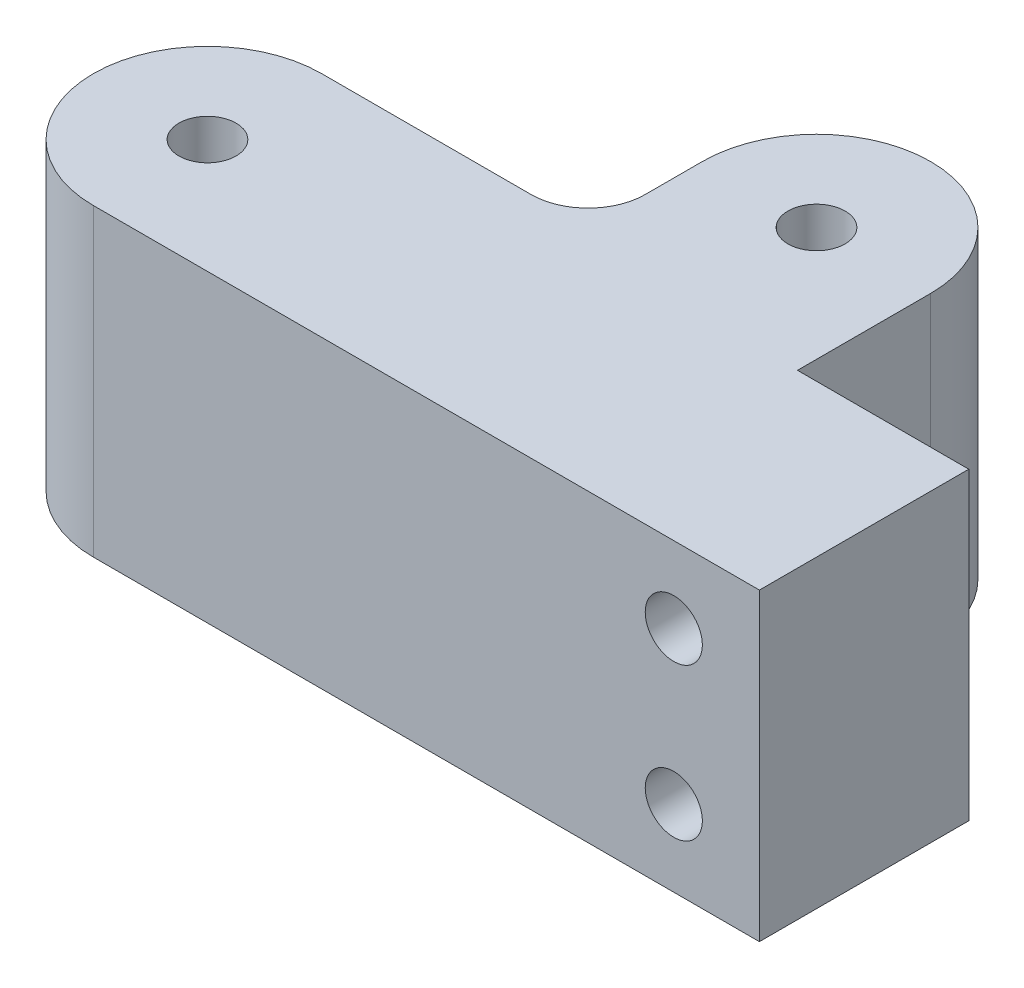
ISO-10303-21;
HEADER;
FILE_DESCRIPTION(('STEP AP214'),'2;1');
FILE_NAME('part.step','',(''),(''),'','','');
FILE_SCHEMA(('AUTOMOTIVE_DESIGN { 1 0 10303 214 1 1 1 1 }'));
ENDSEC;
DATA;
#1=APPLICATION_CONTEXT('core data for automotive mechanical design processes');
#2=APPLICATION_PROTOCOL_DEFINITION('international standard','automotive_design',2000,#1);
#3=PRODUCT_CONTEXT('',#1,'mechanical');
#4=PRODUCT('Part','Part','',(#3));
#5=PRODUCT_RELATED_PRODUCT_CATEGORY('part','',(#4));
#6=PRODUCT_DEFINITION_FORMATION('','',#4);
#7=PRODUCT_DEFINITION_CONTEXT('part definition',#1,'design');
#8=PRODUCT_DEFINITION('design','',#6,#7);
#9=PRODUCT_DEFINITION_SHAPE('','',#8);
#10=(LENGTH_UNIT() NAMED_UNIT(*) SI_UNIT(.MILLI.,.METRE.));
#11=(NAMED_UNIT(*) PLANE_ANGLE_UNIT() SI_UNIT($,.RADIAN.));
#12=(NAMED_UNIT(*) SI_UNIT($,.STERADIAN.) SOLID_ANGLE_UNIT());
#13=UNCERTAINTY_MEASURE_WITH_UNIT(LENGTH_MEASURE(1.E-05),#10,'distance_accuracy_value','');
#14=(GEOMETRIC_REPRESENTATION_CONTEXT(3) GLOBAL_UNCERTAINTY_ASSIGNED_CONTEXT((#13)) GLOBAL_UNIT_ASSIGNED_CONTEXT((#10,
#11,#12)) REPRESENTATION_CONTEXT('',''));
#15=CARTESIAN_POINT('',(0.,0.,0.));
#16=DIRECTION('',(0.,0.,1.));
#17=DIRECTION('',(1.,0.,0.));
#18=AXIS2_PLACEMENT_3D('',#15,#16,#17);
#19=CARTESIAN_POINT('',(26.,16.,0.));
#20=DIRECTION('',(1.,0.,0.));
#21=DIRECTION('',(0.,0.,-1.));
#22=AXIS2_PLACEMENT_3D('',#19,#20,#21);
#23=PLANE('',#22);
#24=DIRECTION('',(0.,0.,1.));
#25=VECTOR('',#24,1.);
#26=CARTESIAN_POINT('',(26.,0.,0.));
#27=LINE('',#26,#25);
#28=CARTESIAN_POINT('',(26.,0.,-12.));
#29=VERTEX_POINT('',#28);
#30=CARTESIAN_POINT('',(26.,0.,-5.));
#31=VERTEX_POINT('',#30);
#32=EDGE_CURVE('E114',#29,#31,#27,.T.);
#33=ORIENTED_EDGE('',*,*,#32,.F.);
#34=DIRECTION('',(0.,-1.,0.));
#35=VECTOR('',#34,1.);
#36=CARTESIAN_POINT('',(26.,16.,-12.));
#37=LINE('',#36,#35);
#38=CARTESIAN_POINT('',(26.,16.,-12.));
#39=VERTEX_POINT('',#38);
#40=EDGE_CURVE('E108',#39,#29,#37,.T.);
#41=ORIENTED_EDGE('',*,*,#40,.F.);
#42=DIRECTION('',(0.,0.,1.));
#43=VECTOR('',#42,1.);
#44=CARTESIAN_POINT('',(26.,16.,0.));
#45=LINE('',#44,#43);
#46=CARTESIAN_POINT('',(26.,16.,-5.));
#47=VERTEX_POINT('',#46);
#48=EDGE_CURVE('E111',#39,#47,#45,.T.);
#49=ORIENTED_EDGE('',*,*,#48,.T.);
#50=DIRECTION('',(0.,-1.,0.));
#51=VECTOR('',#50,1.);
#52=CARTESIAN_POINT('',(26.,16.,-5.));
#53=LINE('',#52,#51);
#54=EDGE_CURVE('E157',#47,#31,#53,.T.);
#55=ORIENTED_EDGE('',*,*,#54,.T.);
#56=EDGE_LOOP('',(#33,#41,#49,#55));
#57=FACE_BOUND('',#56,.T.);
#58=ADVANCED_FACE('F37',(#57),#23,.T.);
#59=CARTESIAN_POINT('',(20.,16.,-12.));
#60=DIRECTION('',(0.,-1.,0.));
#61=DIRECTION('',(0.,0.,-1.));
#62=AXIS2_PLACEMENT_3D('',#59,#60,#61);
#63=CYLINDRICAL_SURFACE('',#62,6.);
#64=CARTESIAN_POINT('',(20.,0.,-12.));
#65=DIRECTION('',(0.,1.,0.));
#66=DIRECTION('',(0.,0.,1.));
#67=AXIS2_PLACEMENT_3D('',#64,#65,#66);
#68=CIRCLE('',#67,6.);
#69=CARTESIAN_POINT('',(14.,0.,-12.));
#70=VERTEX_POINT('',#69);
#71=EDGE_CURVE('E159',#29,#70,#68,.T.);
#72=ORIENTED_EDGE('',*,*,#71,.T.);
#73=DIRECTION('',(0.,-1.,0.));
#74=VECTOR('',#73,1.);
#75=CARTESIAN_POINT('',(14.,16.,-12.));
#76=LINE('',#75,#74);
#77=CARTESIAN_POINT('',(14.,16.,-12.));
#78=VERTEX_POINT('',#77);
#79=EDGE_CURVE('E118',#78,#70,#76,.T.);
#80=ORIENTED_EDGE('',*,*,#79,.F.);
#81=CARTESIAN_POINT('',(20.,16.,-12.));
#82=DIRECTION('',(0.,1.,0.));
#83=DIRECTION('',(0.,0.,1.));
#84=AXIS2_PLACEMENT_3D('',#81,#82,#83);
#85=CIRCLE('',#84,6.);
#86=EDGE_CURVE('E121',#39,#78,#85,.T.);
#87=ORIENTED_EDGE('',*,*,#86,.F.);
#88=ORIENTED_EDGE('',*,*,#40,.T.);
#89=EDGE_LOOP('',(#72,#80,#87,#88));
#90=FACE_BOUND('',#89,.T.);
#91=ADVANCED_FACE('F122',(#90),#63,.T.);
#92=CARTESIAN_POINT('',(14.,16.,0.));
#93=DIRECTION('',(1.,0.,0.));
#94=DIRECTION('',(0.,0.,-1.));
#95=AXIS2_PLACEMENT_3D('',#92,#93,#94);
#96=PLANE('',#95);
#97=DIRECTION('',(0.,0.,1.));
#98=VECTOR('',#97,1.);
#99=CARTESIAN_POINT('',(14.,0.,0.));
#100=LINE('',#99,#98);
#101=CARTESIAN_POINT('',(14.,0.,-9.));
#102=VERTEX_POINT('',#101);
#103=EDGE_CURVE('E162',#70,#102,#100,.T.);
#104=ORIENTED_EDGE('',*,*,#103,.T.);
#105=DIRECTION('',(0.,-1.,0.));
#106=VECTOR('',#105,1.);
#107=CARTESIAN_POINT('',(14.,16.,-9.));
#108=LINE('',#107,#106);
#109=CARTESIAN_POINT('',(14.,16.,-9.));
#110=VERTEX_POINT('',#109);
#111=EDGE_CURVE('E52',#102,#110,#108,.F.);
#112=ORIENTED_EDGE('',*,*,#111,.T.);
#113=DIRECTION('',(0.,0.,1.));
#114=VECTOR('',#113,1.);
#115=CARTESIAN_POINT('',(14.,16.,0.));
#116=LINE('',#115,#114);
#117=EDGE_CURVE('E125',#78,#110,#116,.T.);
#118=ORIENTED_EDGE('',*,*,#117,.F.);
#119=ORIENTED_EDGE('',*,*,#79,.T.);
#120=EDGE_LOOP('',(#104,#112,#118,#119));
#121=FACE_BOUND('',#120,.T.);
#122=ADVANCED_FACE('F228',(#121),#96,.F.);
#123=CARTESIAN_POINT('',(0.,16.,-6.));
#124=DIRECTION('',(0.,0.,-1.));
#125=DIRECTION('',(-1.,0.,0.));
#126=AXIS2_PLACEMENT_3D('',#123,#124,#125);
#127=PLANE('',#126);
#128=DIRECTION('',(1.,0.,0.));
#129=VECTOR('',#128,1.);
#130=CARTESIAN_POINT('',(0.,16.,-6.));
#131=LINE('',#130,#129);
#132=CARTESIAN_POINT('',(0.,16.,-6.));
#133=VERTEX_POINT('',#132);
#134=CARTESIAN_POINT('',(11.,16.,-6.));
#135=VERTEX_POINT('',#134);
#136=EDGE_CURVE('E141',#133,#135,#131,.T.);
#137=ORIENTED_EDGE('',*,*,#136,.T.);
#138=DIRECTION('',(0.,-1.,0.));
#139=VECTOR('',#138,1.);
#140=CARTESIAN_POINT('',(11.,16.,-6.));
#141=LINE('',#140,#139);
#142=CARTESIAN_POINT('',(11.,0.,-6.));
#143=VERTEX_POINT('',#142);
#144=EDGE_CURVE('E117',#135,#143,#141,.T.);
#145=ORIENTED_EDGE('',*,*,#144,.T.);
#146=DIRECTION('',(1.,0.,0.));
#147=VECTOR('',#146,1.);
#148=CARTESIAN_POINT('',(0.,0.,-6.));
#149=LINE('',#148,#147);
#150=CARTESIAN_POINT('',(0.,0.,-6.));
#151=VERTEX_POINT('',#150);
#152=EDGE_CURVE('E164',#151,#143,#149,.T.);
#153=ORIENTED_EDGE('',*,*,#152,.F.);
#154=DIRECTION('',(0.,-1.,0.));
#155=VECTOR('',#154,1.);
#156=CARTESIAN_POINT('',(0.,16.,-6.));
#157=LINE('',#156,#155);
#158=EDGE_CURVE('E187',#133,#151,#157,.T.);
#159=ORIENTED_EDGE('',*,*,#158,.F.);
#160=EDGE_LOOP('',(#137,#145,#153,#159));
#161=FACE_BOUND('',#160,.T.);
#162=ADVANCED_FACE('F195',(#161),#127,.T.);
#163=CARTESIAN_POINT('',(0.,16.,0.));
#164=DIRECTION('',(0.,-1.,0.));
#165=DIRECTION('',(0.,0.,-1.));
#166=AXIS2_PLACEMENT_3D('',#163,#164,#165);
#167=CYLINDRICAL_SURFACE('',#166,6.);
#168=CARTESIAN_POINT('',(0.,0.,0.));
#169=DIRECTION('',(0.,1.,0.));
#170=DIRECTION('',(0.,0.,1.));
#171=AXIS2_PLACEMENT_3D('',#168,#169,#170);
#172=CIRCLE('',#171,6.);
#173=CARTESIAN_POINT('',(0.,0.,6.));
#174=VERTEX_POINT('',#173);
#175=EDGE_CURVE('E166',#151,#174,#172,.T.);
#176=ORIENTED_EDGE('',*,*,#175,.T.);
#177=DIRECTION('',(0.,-1.,0.));
#178=VECTOR('',#177,1.);
#179=CARTESIAN_POINT('',(0.,16.,6.));
#180=LINE('',#179,#178);
#181=CARTESIAN_POINT('',(0.,16.,6.));
#182=VERTEX_POINT('',#181);
#183=EDGE_CURVE('E184',#182,#174,#180,.T.);
#184=ORIENTED_EDGE('',*,*,#183,.F.);
#185=CARTESIAN_POINT('',(0.,16.,0.));
#186=DIRECTION('',(0.,1.,0.));
#187=DIRECTION('',(0.,0.,1.));
#188=AXIS2_PLACEMENT_3D('',#185,#186,#187);
#189=CIRCLE('',#188,6.);
#190=EDGE_CURVE('E144',#133,#182,#189,.T.);
#191=ORIENTED_EDGE('',*,*,#190,.F.);
#192=ORIENTED_EDGE('',*,*,#158,.T.);
#193=EDGE_LOOP('',(#176,#184,#191,#192));
#194=FACE_BOUND('',#193,.T.);
#195=ADVANCED_FACE('F206',(#194),#167,.T.);
#196=CARTESIAN_POINT('',(0.,16.,6.));
#197=DIRECTION('',(0.,0.,-1.));
#198=DIRECTION('',(-1.,0.,0.));
#199=AXIS2_PLACEMENT_3D('',#196,#197,#198);
#200=PLANE('',#199);
#201=CARTESIAN_POINT('',(30.5,12.,6.));
#202=DIRECTION('',(0.,0.,-1.));
#203=DIRECTION('',(-1.,0.,0.));
#204=AXIS2_PLACEMENT_3D('',#201,#202,#203);
#205=CIRCLE('',#204,1.5);
#206=CARTESIAN_POINT('',(29.,12.,6.));
#207=VERTEX_POINT('',#206);
#208=EDGE_CURVE('E160',#207,#207,#205,.T.);
#209=ORIENTED_EDGE('',*,*,#208,.T.);
#210=EDGE_LOOP('',(#209));
#211=FACE_BOUND('',#210,.T.);
#212=CARTESIAN_POINT('',(30.5,4.,6.));
#213=DIRECTION('',(0.,0.,-1.));
#214=DIRECTION('',(-1.,0.,0.));
#215=AXIS2_PLACEMENT_3D('',#212,#213,#214);
#216=CIRCLE('',#215,1.5);
#217=CARTESIAN_POINT('',(29.,4.,6.));
#218=VERTEX_POINT('',#217);
#219=EDGE_CURVE('E268',#218,#218,#216,.T.);
#220=ORIENTED_EDGE('',*,*,#219,.T.);
#221=EDGE_LOOP('',(#220));
#222=FACE_BOUND('',#221,.T.);
#223=DIRECTION('',(1.,0.,0.));
#224=VECTOR('',#223,1.);
#225=CARTESIAN_POINT('',(0.,0.,6.));
#226=LINE('',#225,#224);
#227=CARTESIAN_POINT('',(35.,0.,6.));
#228=VERTEX_POINT('',#227);
#229=EDGE_CURVE('E168',#174,#228,#226,.T.);
#230=ORIENTED_EDGE('',*,*,#229,.T.);
#231=DIRECTION('',(0.,-1.,0.));
#232=VECTOR('',#231,1.);
#233=CARTESIAN_POINT('',(35.,16.,6.));
#234=LINE('',#233,#232);
#235=CARTESIAN_POINT('',(35.,16.,6.));
#236=VERTEX_POINT('',#235);
#237=EDGE_CURVE('E181',#236,#228,#234,.T.);
#238=ORIENTED_EDGE('',*,*,#237,.F.);
#239=DIRECTION('',(1.,0.,0.));
#240=VECTOR('',#239,1.);
#241=CARTESIAN_POINT('',(0.,16.,6.));
#242=LINE('',#241,#240);
#243=EDGE_CURVE('E146',#182,#236,#242,.T.);
#244=ORIENTED_EDGE('',*,*,#243,.F.);
#245=ORIENTED_EDGE('',*,*,#183,.T.);
#246=EDGE_LOOP('',(#230,#238,#244,#245));
#247=FACE_BOUND('',#246,.T.);
#248=ADVANCED_FACE('F210',(#211,#222,#247),#200,.F.);
#249=CARTESIAN_POINT('',(35.,16.,0.));
#250=DIRECTION('',(-1.,0.,0.));
#251=DIRECTION('',(0.,0.,1.));
#252=AXIS2_PLACEMENT_3D('',#249,#250,#251);
#253=PLANE('',#252);
#254=DIRECTION('',(0.,0.,-1.));
#255=VECTOR('',#254,1.);
#256=CARTESIAN_POINT('',(35.,0.,0.));
#257=LINE('',#256,#255);
#258=CARTESIAN_POINT('',(35.,0.,-5.));
#259=VERTEX_POINT('',#258);
#260=EDGE_CURVE('E170',#228,#259,#257,.T.);
#261=ORIENTED_EDGE('',*,*,#260,.T.);
#262=DIRECTION('',(0.,-1.,0.));
#263=VECTOR('',#262,1.);
#264=CARTESIAN_POINT('',(35.,16.,-5.));
#265=LINE('',#264,#263);
#266=CARTESIAN_POINT('',(35.,16.,-5.));
#267=VERTEX_POINT('',#266);
#268=EDGE_CURVE('E179',#267,#259,#265,.T.);
#269=ORIENTED_EDGE('',*,*,#268,.F.);
#270=DIRECTION('',(0.,0.,-1.));
#271=VECTOR('',#270,1.);
#272=CARTESIAN_POINT('',(35.,16.,0.));
#273=LINE('',#272,#271);
#274=EDGE_CURVE('E148',#236,#267,#273,.T.);
#275=ORIENTED_EDGE('',*,*,#274,.F.);
#276=ORIENTED_EDGE('',*,*,#237,.T.);
#277=EDGE_LOOP('',(#261,#269,#275,#276));
#278=FACE_BOUND('',#277,.T.);
#279=ADVANCED_FACE('F239',(#278),#253,.F.);
#280=CARTESIAN_POINT('',(20.,16.,-12.));
#281=DIRECTION('',(0.,-1.,0.));
#282=DIRECTION('',(0.,0.,-1.));
#283=AXIS2_PLACEMENT_3D('',#280,#281,#282);
#284=CYLINDRICAL_SURFACE('',#283,1.5);
#285=CARTESIAN_POINT('',(20.,16.,-12.));
#286=DIRECTION('',(0.,1.,0.));
#287=DIRECTION('',(0.,0.,1.));
#288=AXIS2_PLACEMENT_3D('',#285,#286,#287);
#289=CIRCLE('',#288,1.5);
#290=CARTESIAN_POINT('',(20.,16.,-10.5));
#291=VERTEX_POINT('',#290);
#292=EDGE_CURVE('E151',#291,#291,#289,.T.);
#293=ORIENTED_EDGE('',*,*,#292,.T.);
#294=EDGE_LOOP('',(#293));
#295=FACE_BOUND('',#294,.T.);
#296=CARTESIAN_POINT('',(20.,0.,-12.));
#297=DIRECTION('',(0.,1.,0.));
#298=DIRECTION('',(0.,0.,1.));
#299=AXIS2_PLACEMENT_3D('',#296,#297,#298);
#300=CIRCLE('',#299,1.5);
#301=CARTESIAN_POINT('',(20.,0.,-10.5));
#302=VERTEX_POINT('',#301);
#303=EDGE_CURVE('E134',#302,#302,#300,.T.);
#304=ORIENTED_EDGE('',*,*,#303,.F.);
#305=EDGE_LOOP('',(#304));
#306=FACE_BOUND('',#305,.T.);
#307=ADVANCED_FACE('F243',(#295,#306),#284,.F.);
#308=CARTESIAN_POINT('',(0.,16.,-5.));
#309=DIRECTION('',(0.,0.,-1.));
#310=DIRECTION('',(-1.,0.,0.));
#311=AXIS2_PLACEMENT_3D('',#308,#309,#310);
#312=PLANE('',#311);
#313=CARTESIAN_POINT('',(30.5,12.,-5.));
#314=DIRECTION('',(0.,0.,-1.));
#315=DIRECTION('',(-1.,0.,0.));
#316=AXIS2_PLACEMENT_3D('',#313,#314,#315);
#317=CIRCLE('',#316,1.5);
#318=CARTESIAN_POINT('',(29.,12.,-5.));
#319=VERTEX_POINT('',#318);
#320=EDGE_CURVE('E267',#319,#319,#317,.T.);
#321=ORIENTED_EDGE('',*,*,#320,.F.);
#322=EDGE_LOOP('',(#321));
#323=FACE_BOUND('',#322,.T.);
#324=CARTESIAN_POINT('',(30.5,4.,-5.));
#325=DIRECTION('',(0.,0.,-1.));
#326=DIRECTION('',(-1.,0.,0.));
#327=AXIS2_PLACEMENT_3D('',#324,#325,#326);
#328=CIRCLE('',#327,1.5);
#329=CARTESIAN_POINT('',(29.,4.,-5.));
#330=VERTEX_POINT('',#329);
#331=EDGE_CURVE('E137',#330,#330,#328,.T.);
#332=ORIENTED_EDGE('',*,*,#331,.F.);
#333=EDGE_LOOP('',(#332));
#334=FACE_BOUND('',#333,.T.);
#335=DIRECTION('',(1.,0.,0.));
#336=VECTOR('',#335,1.);
#337=CARTESIAN_POINT('',(0.,0.,-5.));
#338=LINE('',#337,#336);
#339=EDGE_CURVE('E173',#31,#259,#338,.T.);
#340=ORIENTED_EDGE('',*,*,#339,.F.);
#341=ORIENTED_EDGE('',*,*,#54,.F.);
#342=DIRECTION('',(1.,0.,0.));
#343=VECTOR('',#342,1.);
#344=CARTESIAN_POINT('',(0.,16.,-5.));
#345=LINE('',#344,#343);
#346=EDGE_CURVE('E130',#47,#267,#345,.T.);
#347=ORIENTED_EDGE('',*,*,#346,.T.);
#348=ORIENTED_EDGE('',*,*,#268,.T.);
#349=EDGE_LOOP('',(#340,#341,#347,#348));
#350=FACE_BOUND('',#349,.T.);
#351=ADVANCED_FACE('F245',(#323,#334,#350),#312,.T.);
#352=CARTESIAN_POINT('',(0.,16.,0.));
#353=DIRECTION('',(0.,-1.,0.));
#354=DIRECTION('',(0.,0.,-1.));
#355=AXIS2_PLACEMENT_3D('',#352,#353,#354);
#356=CYLINDRICAL_SURFACE('',#355,1.5);
#357=CARTESIAN_POINT('',(0.,16.,0.));
#358=DIRECTION('',(0.,1.,0.));
#359=DIRECTION('',(0.,0.,1.));
#360=AXIS2_PLACEMENT_3D('',#357,#358,#359);
#361=CIRCLE('',#360,1.5);
#362=CARTESIAN_POINT('',(0.,16.,1.5));
#363=VERTEX_POINT('',#362);
#364=EDGE_CURVE('E154',#363,#363,#361,.T.);
#365=ORIENTED_EDGE('',*,*,#364,.T.);
#366=EDGE_LOOP('',(#365));
#367=FACE_BOUND('',#366,.T.);
#368=CARTESIAN_POINT('',(0.,0.,0.));
#369=DIRECTION('',(0.,1.,0.));
#370=DIRECTION('',(0.,0.,1.));
#371=AXIS2_PLACEMENT_3D('',#368,#369,#370);
#372=CIRCLE('',#371,1.5);
#373=CARTESIAN_POINT('',(0.,0.,1.5));
#374=VERTEX_POINT('',#373);
#375=EDGE_CURVE('E131',#374,#374,#372,.T.);
#376=ORIENTED_EDGE('',*,*,#375,.F.);
#377=EDGE_LOOP('',(#376));
#378=FACE_BOUND('',#377,.T.);
#379=ADVANCED_FACE('F248',(#367,#378),#356,.F.);
#380=CARTESIAN_POINT('',(0.,16.,0.));
#381=DIRECTION('',(0.,1.,0.));
#382=DIRECTION('',(0.,0.,1.));
#383=AXIS2_PLACEMENT_3D('',#380,#381,#382);
#384=PLANE('',#383);
#385=ORIENTED_EDGE('',*,*,#48,.F.);
#386=ORIENTED_EDGE('',*,*,#86,.T.);
#387=ORIENTED_EDGE('',*,*,#117,.T.);
#388=CARTESIAN_POINT('',(11.,16.,-9.));
#389=DIRECTION('',(0.,1.,0.));
#390=DIRECTION('',(0.,0.,1.));
#391=AXIS2_PLACEMENT_3D('',#388,#389,#390);
#392=CIRCLE('',#391,3.);
#393=EDGE_CURVE('E11',#110,#135,#392,.F.);
#394=ORIENTED_EDGE('',*,*,#393,.T.);
#395=ORIENTED_EDGE('',*,*,#136,.F.);
#396=ORIENTED_EDGE('',*,*,#190,.T.);
#397=ORIENTED_EDGE('',*,*,#243,.T.);
#398=ORIENTED_EDGE('',*,*,#274,.T.);
#399=ORIENTED_EDGE('',*,*,#346,.F.);
#400=EDGE_LOOP('',(#385,#386,#387,#394,#395,#396,#397,#398,#399));
#401=FACE_BOUND('',#400,.T.);
#402=ORIENTED_EDGE('',*,*,#292,.F.);
#403=EDGE_LOOP('',(#402));
#404=FACE_BOUND('',#403,.T.);
#405=ORIENTED_EDGE('',*,*,#364,.F.);
#406=EDGE_LOOP('',(#405));
#407=FACE_BOUND('',#406,.T.);
#408=ADVANCED_FACE('F127',(#401,#404,#407),#384,.T.);
#409=CARTESIAN_POINT('',(0.,0.,0.));
#410=DIRECTION('',(0.,1.,0.));
#411=DIRECTION('',(0.,0.,1.));
#412=AXIS2_PLACEMENT_3D('',#409,#410,#411);
#413=PLANE('',#412);
#414=ORIENTED_EDGE('',*,*,#32,.T.);
#415=ORIENTED_EDGE('',*,*,#339,.T.);
#416=ORIENTED_EDGE('',*,*,#260,.F.);
#417=ORIENTED_EDGE('',*,*,#229,.F.);
#418=ORIENTED_EDGE('',*,*,#175,.F.);
#419=ORIENTED_EDGE('',*,*,#152,.T.);
#420=CARTESIAN_POINT('',(11.,0.,-9.));
#421=DIRECTION('',(0.,1.,0.));
#422=DIRECTION('',(0.,0.,1.));
#423=AXIS2_PLACEMENT_3D('',#420,#421,#422);
#424=CIRCLE('',#423,3.);
#425=EDGE_CURVE('E45',#143,#102,#424,.T.);
#426=ORIENTED_EDGE('',*,*,#425,.T.);
#427=ORIENTED_EDGE('',*,*,#103,.F.);
#428=ORIENTED_EDGE('',*,*,#71,.F.);
#429=EDGE_LOOP('',(#414,#415,#416,#417,#418,#419,#426,#427,#428));
#430=FACE_BOUND('',#429,.T.);
#431=ORIENTED_EDGE('',*,*,#303,.T.);
#432=EDGE_LOOP('',(#431));
#433=FACE_BOUND('',#432,.T.);
#434=ORIENTED_EDGE('',*,*,#375,.T.);
#435=EDGE_LOOP('',(#434));
#436=FACE_BOUND('',#435,.T.);
#437=ADVANCED_FACE('F200',(#430,#433,#436),#413,.F.);
#438=CARTESIAN_POINT('',(11.,16.,-9.));
#439=DIRECTION('',(0.,-1.,0.));
#440=DIRECTION('',(0.,0.,-1.));
#441=AXIS2_PLACEMENT_3D('',#438,#439,#440);
#442=CYLINDRICAL_SURFACE('',#441,3.);
#443=ORIENTED_EDGE('',*,*,#393,.F.);
#444=ORIENTED_EDGE('',*,*,#111,.F.);
#445=ORIENTED_EDGE('',*,*,#425,.F.);
#446=ORIENTED_EDGE('',*,*,#144,.F.);
#447=EDGE_LOOP('',(#443,#444,#445,#446));
#448=FACE_BOUND('',#447,.T.);
#449=ADVANCED_FACE('F39',(#448),#442,.F.);
#450=CARTESIAN_POINT('',(30.5,4.,6.));
#451=DIRECTION('',(0.,0.,-1.));
#452=DIRECTION('',(-1.,0.,0.));
#453=AXIS2_PLACEMENT_3D('',#450,#451,#452);
#454=CYLINDRICAL_SURFACE('',#453,1.5);
#455=ORIENTED_EDGE('',*,*,#219,.F.);
#456=EDGE_LOOP('',(#455));
#457=FACE_BOUND('',#456,.T.);
#458=ORIENTED_EDGE('',*,*,#331,.T.);
#459=EDGE_LOOP('',(#458));
#460=FACE_BOUND('',#459,.T.);
#461=ADVANCED_FACE('F215',(#457,#460),#454,.F.);
#462=CARTESIAN_POINT('',(30.5,12.,6.));
#463=DIRECTION('',(0.,0.,-1.));
#464=DIRECTION('',(-1.,0.,0.));
#465=AXIS2_PLACEMENT_3D('',#462,#463,#464);
#466=CYLINDRICAL_SURFACE('',#465,1.5);
#467=ORIENTED_EDGE('',*,*,#208,.F.);
#468=EDGE_LOOP('',(#467));
#469=FACE_BOUND('',#468,.T.);
#470=ORIENTED_EDGE('',*,*,#320,.T.);
#471=EDGE_LOOP('',(#470));
#472=FACE_BOUND('',#471,.T.);
#473=ADVANCED_FACE('F220',(#469,#472),#466,.F.);
#474=CLOSED_SHELL('',(#58,#91,#122,#162,#195,#248,#279,#307,#351,#379,#408,#437,#449,#461,#473));
#475=MANIFOLD_SOLID_BREP('B2',#474);
#476=ADVANCED_BREP_SHAPE_REPRESENTATION('',(#18,#475),#14);
#477=SHAPE_DEFINITION_REPRESENTATION(#9,#476);
ENDSEC;
END-ISO-10303-21;
